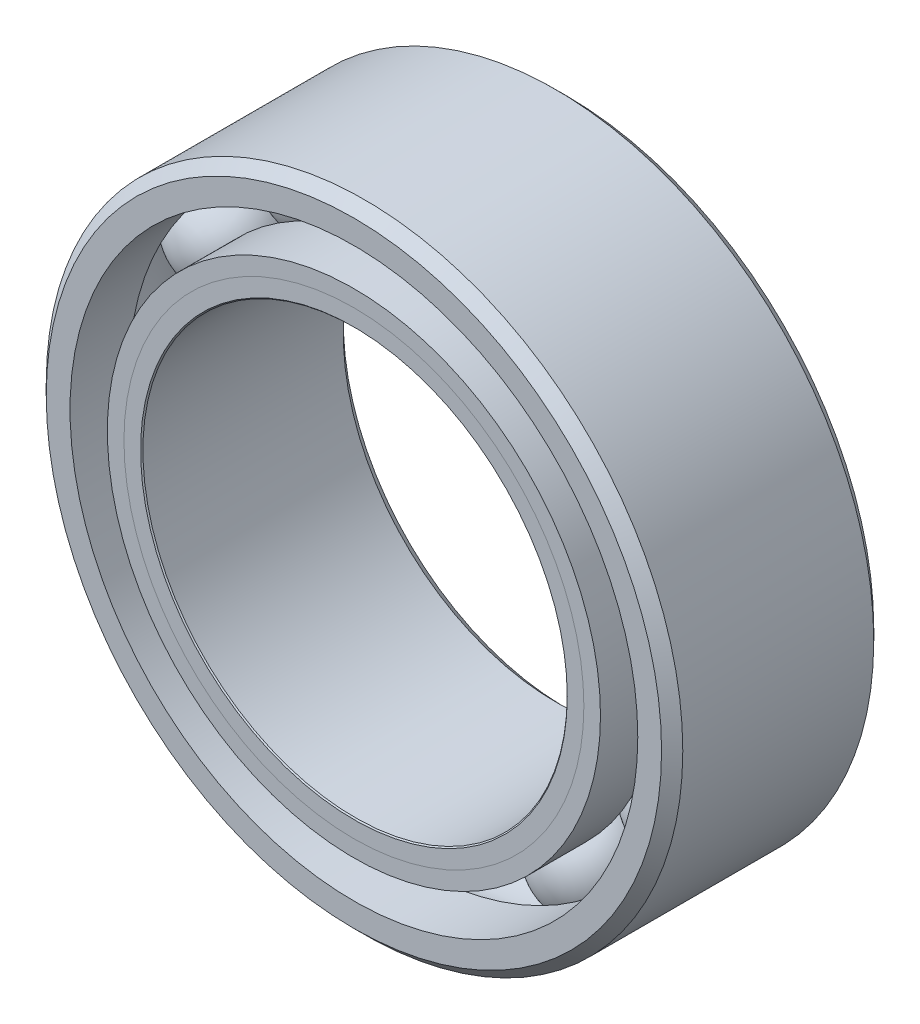
ISO-10303-21;
HEADER;
FILE_DESCRIPTION(('STEP AP214'),'2;1');
FILE_NAME('part.step','',(''),(''),'','','');
FILE_SCHEMA(('AUTOMOTIVE_DESIGN { 1 0 10303 214 1 1 1 1 }'));
ENDSEC;
DATA;
#1=APPLICATION_CONTEXT('core data for automotive mechanical design processes');
#2=APPLICATION_PROTOCOL_DEFINITION('international standard','automotive_design',2000,#1);
#3=PRODUCT_CONTEXT('',#1,'mechanical');
#4=PRODUCT('Part','Part','',(#3));
#5=PRODUCT_RELATED_PRODUCT_CATEGORY('part','',(#4));
#6=PRODUCT_DEFINITION_FORMATION('','',#4);
#7=PRODUCT_DEFINITION_CONTEXT('part definition',#1,'design');
#8=PRODUCT_DEFINITION('design','',#6,#7);
#9=PRODUCT_DEFINITION_SHAPE('','',#8);
#10=(LENGTH_UNIT() NAMED_UNIT(*) SI_UNIT(.MILLI.,.METRE.));
#11=(NAMED_UNIT(*) PLANE_ANGLE_UNIT() SI_UNIT($,.RADIAN.));
#12=(NAMED_UNIT(*) SI_UNIT($,.STERADIAN.) SOLID_ANGLE_UNIT());
#13=UNCERTAINTY_MEASURE_WITH_UNIT(LENGTH_MEASURE(1.E-05),#10,'distance_accuracy_value','');
#14=(GEOMETRIC_REPRESENTATION_CONTEXT(3) GLOBAL_UNCERTAINTY_ASSIGNED_CONTEXT((#13)) GLOBAL_UNIT_ASSIGNED_CONTEXT((#10,
#11,#12)) REPRESENTATION_CONTEXT('',''));
#15=CARTESIAN_POINT('',(0.,0.,0.));
#16=DIRECTION('',(0.,0.,1.));
#17=DIRECTION('',(1.,0.,0.));
#18=AXIS2_PLACEMENT_3D('',#15,#16,#17);
#19=CARTESIAN_POINT('',(-1.98437499999996,3.43703832126952,0.));
#20=DIRECTION('',(0.,0.,1.));
#21=DIRECTION('',(-0.499999999999989,0.866025403784445,0.));
#22=AXIS2_PLACEMENT_3D('',#19,#20,#21);
#23=SPHERICAL_SURFACE('',#22,0.758760243513404);
#24=CARTESIAN_POINT('',(-1.98437499999996,3.43703832126952,0.758760243513404));
#25=VERTEX_POINT('',#24);
#26=VERTEX_LOOP('',#25);
#27=FACE_BOUND('',#26,.T.);
#28=ADVANCED_FACE('F48',(#27),#23,.T.);
#29=CLOSED_SHELL('',(#28));
#30=MANIFOLD_SOLID_BREP('B2',#29);
#31=CARTESIAN_POINT('',(-3.43703832126947,1.98437500000004,0.));
#32=DIRECTION('',(0.,0.,1.));
#33=DIRECTION('',(-0.866025403784433,0.50000000000001,0.));
#34=AXIS2_PLACEMENT_3D('',#31,#32,#33);
#35=SPHERICAL_SURFACE('',#34,0.758760243513404);
#36=CARTESIAN_POINT('',(-3.43703832126947,1.98437500000004,0.758760243513404));
#37=VERTEX_POINT('',#36);
#38=VERTEX_LOOP('',#37);
#39=FACE_BOUND('',#38,.T.);
#40=ADVANCED_FACE('F88',(#39),#35,.T.);
#41=CLOSED_SHELL('',(#40));
#42=MANIFOLD_SOLID_BREP('B6',#41);
#43=CARTESIAN_POINT('',(-3.96875,0.,0.));
#44=DIRECTION('',(0.,0.,1.));
#45=DIRECTION('',(-1.,0.,0.));
#46=AXIS2_PLACEMENT_3D('',#43,#44,#45);
#47=SPHERICAL_SURFACE('',#46,0.758760243513404);
#48=CARTESIAN_POINT('',(-3.96875,0.,0.758760243513404));
#49=VERTEX_POINT('',#48);
#50=VERTEX_LOOP('',#49);
#51=FACE_BOUND('',#50,.T.);
#52=ADVANCED_FACE('F128',(#51),#47,.T.);
#53=CLOSED_SHELL('',(#52));
#54=MANIFOLD_SOLID_BREP('B44',#53);
#55=CARTESIAN_POINT('',(-3.43703832126951,-1.98437499999997,0.));
#56=DIRECTION('',(0.,0.,1.));
#57=DIRECTION('',(-0.866025403784443,-0.499999999999992,0.));
#58=AXIS2_PLACEMENT_3D('',#55,#56,#57);
#59=SPHERICAL_SURFACE('',#58,0.758760243513404);
#60=CARTESIAN_POINT('',(-3.43703832126951,-1.98437499999997,0.758760243513404));
#61=VERTEX_POINT('',#60);
#62=VERTEX_LOOP('',#61);
#63=FACE_BOUND('',#62,.T.);
#64=ADVANCED_FACE('F168',(#63),#59,.T.);
#65=CLOSED_SHELL('',(#64));
#66=MANIFOLD_SOLID_BREP('B84',#65);
#67=CARTESIAN_POINT('',(-1.98437500000003,-3.43703832126947,0.));
#68=DIRECTION('',(0.,0.,1.));
#69=DIRECTION('',(-0.500000000000007,-0.866025403784435,0.));
#70=AXIS2_PLACEMENT_3D('',#67,#68,#69);
#71=SPHERICAL_SURFACE('',#70,0.758760243513404);
#72=CARTESIAN_POINT('',(-1.98437500000003,-3.43703832126947,0.758760243513404));
#73=VERTEX_POINT('',#72);
#74=VERTEX_LOOP('',#73);
#75=FACE_BOUND('',#74,.T.);
#76=ADVANCED_FACE('F208',(#75),#71,.T.);
#77=CLOSED_SHELL('',(#76));
#78=MANIFOLD_SOLID_BREP('B124',#77);
#79=CARTESIAN_POINT('',(0.,-3.96875,0.));
#80=DIRECTION('',(0.,0.,1.));
#81=DIRECTION('',(0.,-1.,0.));
#82=AXIS2_PLACEMENT_3D('',#79,#80,#81);
#83=SPHERICAL_SURFACE('',#82,0.758760243513404);
#84=CARTESIAN_POINT('',(0.,-3.96875,0.758760243513404));
#85=VERTEX_POINT('',#84);
#86=VERTEX_LOOP('',#85);
#87=FACE_BOUND('',#86,.T.);
#88=ADVANCED_FACE('F248',(#87),#83,.T.);
#89=CLOSED_SHELL('',(#88));
#90=MANIFOLD_SOLID_BREP('B164',#89);
#91=CARTESIAN_POINT('',(1.98437499999998,-3.4370383212695,0.));
#92=DIRECTION('',(0.,0.,1.));
#93=DIRECTION('',(0.499999999999995,-0.866025403784442,0.));
#94=AXIS2_PLACEMENT_3D('',#91,#92,#93);
#95=SPHERICAL_SURFACE('',#94,0.758760243513404);
#96=CARTESIAN_POINT('',(1.98437499999998,-3.4370383212695,0.758760243513404));
#97=VERTEX_POINT('',#96);
#98=VERTEX_LOOP('',#97);
#99=FACE_BOUND('',#98,.T.);
#100=ADVANCED_FACE('F288',(#99),#95,.T.);
#101=CLOSED_SHELL('',(#100));
#102=MANIFOLD_SOLID_BREP('B204',#101);
#103=CARTESIAN_POINT('',(3.43703832126948,-1.98437500000002,0.));
#104=DIRECTION('',(0.,0.,1.));
#105=DIRECTION('',(0.866025403784436,-0.500000000000004,0.));
#106=AXIS2_PLACEMENT_3D('',#103,#104,#105);
#107=SPHERICAL_SURFACE('',#106,0.758760243513404);
#108=CARTESIAN_POINT('',(3.43703832126948,-1.98437500000002,0.758760243513404));
#109=VERTEX_POINT('',#108);
#110=VERTEX_LOOP('',#109);
#111=FACE_BOUND('',#110,.T.);
#112=ADVANCED_FACE('F328',(#111),#107,.T.);
#113=CLOSED_SHELL('',(#112));
#114=MANIFOLD_SOLID_BREP('B244',#113);
#115=CARTESIAN_POINT('',(3.96875,0.,0.));
#116=DIRECTION('',(0.,0.,1.));
#117=DIRECTION('',(1.,0.,0.));
#118=AXIS2_PLACEMENT_3D('',#115,#116,#117);
#119=SPHERICAL_SURFACE('',#118,0.758760243513404);
#120=CARTESIAN_POINT('',(3.96875,0.,0.758760243513404));
#121=VERTEX_POINT('',#120);
#122=VERTEX_LOOP('',#121);
#123=FACE_BOUND('',#122,.T.);
#124=ADVANCED_FACE('F368',(#123),#119,.T.);
#125=CLOSED_SHELL('',(#124));
#126=MANIFOLD_SOLID_BREP('B284',#125);
#127=CARTESIAN_POINT('',(3.4370383212695,1.98437499999999,0.));
#128=DIRECTION('',(0.,0.,1.));
#129=DIRECTION('',(0.86602540378444,0.499999999999998,0.));
#130=AXIS2_PLACEMENT_3D('',#127,#128,#129);
#131=SPHERICAL_SURFACE('',#130,0.758760243513404);
#132=CARTESIAN_POINT('',(3.4370383212695,1.98437499999999,0.758760243513404));
#133=VERTEX_POINT('',#132);
#134=VERTEX_LOOP('',#133);
#135=FACE_BOUND('',#134,.T.);
#136=ADVANCED_FACE('F408',(#135),#131,.T.);
#137=CLOSED_SHELL('',(#136));
#138=MANIFOLD_SOLID_BREP('B324',#137);
#139=CARTESIAN_POINT('',(1.984375,3.43703832126949,0.));
#140=DIRECTION('',(0.,0.,1.));
#141=DIRECTION('',(0.500000000000001,0.866025403784438,0.));
#142=AXIS2_PLACEMENT_3D('',#139,#140,#141);
#143=SPHERICAL_SURFACE('',#142,0.758760243513404);
#144=CARTESIAN_POINT('',(1.984375,3.43703832126949,0.758760243513404));
#145=VERTEX_POINT('',#144);
#146=VERTEX_LOOP('',#145);
#147=FACE_BOUND('',#146,.T.);
#148=ADVANCED_FACE('F448',(#147),#143,.T.);
#149=CLOSED_SHELL('',(#148));
#150=MANIFOLD_SOLID_BREP('B364',#149);
#151=CARTESIAN_POINT('',(0.,3.96875,0.));
#152=DIRECTION('',(0.,0.,1.));
#153=DIRECTION('',(0.,1.,0.));
#154=AXIS2_PLACEMENT_3D('',#151,#152,#153);
#155=SPHERICAL_SURFACE('',#154,0.758760243513404);
#156=CARTESIAN_POINT('',(0.,3.96875,0.758760243513404));
#157=VERTEX_POINT('',#156);
#158=VERTEX_LOOP('',#157);
#159=FACE_BOUND('',#158,.T.);
#160=ADVANCED_FACE('F490',(#159),#155,.T.);
#161=CLOSED_SHELL('',(#160));
#162=MANIFOLD_SOLID_BREP('B404',#161);
#163=CARTESIAN_POINT('',(0.,3.44106199956121,1.5875));
#164=DIRECTION('',(0.,0.,-1.));
#165=DIRECTION('',(-1.,0.,0.));
#166=AXIS2_PLACEMENT_3D('',#163,#164,#165);
#167=PLANE('',#166);
#168=CARTESIAN_POINT('',(0.,0.,1.5875));
#169=DIRECTION('',(0.,0.,1.));
#170=DIRECTION('',(1.,0.,0.));
#171=AXIS2_PLACEMENT_3D('',#168,#169,#170);
#172=CIRCLE('',#171,3.1924948782433);
#173=CARTESIAN_POINT('',(3.1924948782433,0.,1.5875));
#174=VERTEX_POINT('',#173);
#175=EDGE_CURVE('E543',#174,#174,#172,.T.);
#176=ORIENTED_EDGE('',*,*,#175,.F.);
#177=EDGE_LOOP('',(#176));
#178=FACE_BOUND('',#177,.T.);
#179=CARTESIAN_POINT('',(0.,0.,1.5875));
#180=DIRECTION('',(0.,0.,1.));
#181=DIRECTION('',(1.,0.,0.));
#182=AXIS2_PLACEMENT_3D('',#179,#180,#181);
#183=CIRCLE('',#182,3.44106199956121);
#184=CARTESIAN_POINT('',(3.44106199956121,0.,1.5875));
#185=VERTEX_POINT('',#184);
#186=EDGE_CURVE('E489',#185,#185,#183,.T.);
#187=ORIENTED_EDGE('',*,*,#186,.T.);
#188=EDGE_LOOP('',(#187));
#189=FACE_BOUND('',#188,.T.);
#190=ADVANCED_FACE('F509',(#178,#189),#167,.F.);
#191=CARTESIAN_POINT('',(0.,0.,1.33893287868209));
#192=DIRECTION('',(0.,0.,1.));
#193=DIRECTION('',(1.,0.,0.));
#194=AXIS2_PLACEMENT_3D('',#191,#192,#193);
#195=CONICAL_SURFACE('',#194,3.1924948782433,0.785398163397449);
#196=ORIENTED_EDGE('',*,*,#186,.F.);
#197=EDGE_LOOP('',(#196));
#198=FACE_BOUND('',#197,.T.);
#199=CARTESIAN_POINT('',(0.,0.,1.33893287868209));
#200=DIRECTION('',(0.,0.,1.));
#201=DIRECTION('',(1.,0.,0.));
#202=AXIS2_PLACEMENT_3D('',#199,#200,#201);
#203=CIRCLE('',#202,3.1924948782433);
#204=CARTESIAN_POINT('',(3.1924948782433,0.,1.33893287868209));
#205=VERTEX_POINT('',#204);
#206=EDGE_CURVE('E515',#205,#205,#203,.T.);
#207=ORIENTED_EDGE('',*,*,#206,.T.);
#208=EDGE_LOOP('',(#207));
#209=FACE_BOUND('',#208,.T.);
#210=ADVANCED_FACE('F550',(#198,#209),#195,.T.);
#211=CARTESIAN_POINT('',(0.,0.,1.5875));
#212=DIRECTION('',(0.,0.,1.));
#213=DIRECTION('',(1.,0.,0.));
#214=AXIS2_PLACEMENT_3D('',#211,#212,#213);
#215=CYLINDRICAL_SURFACE('',#214,3.1924948782433);
#216=ORIENTED_EDGE('',*,*,#206,.F.);
#217=EDGE_LOOP('',(#216));
#218=FACE_BOUND('',#217,.T.);
#219=CARTESIAN_POINT('',(0.,0.,0.));
#220=DIRECTION('',(0.,0.,1.));
#221=DIRECTION('',(1.,0.,0.));
#222=AXIS2_PLACEMENT_3D('',#219,#220,#221);
#223=CIRCLE('',#222,3.1924948782433);
#224=CARTESIAN_POINT('',(3.1924948782433,0.,0.));
#225=VERTEX_POINT('',#224);
#226=EDGE_CURVE('E519',#225,#225,#223,.T.);
#227=ORIENTED_EDGE('',*,*,#226,.T.);
#228=EDGE_LOOP('',(#227));
#229=FACE_BOUND('',#228,.T.);
#230=ADVANCED_FACE('F554',(#218,#229),#215,.T.);
#231=CARTESIAN_POINT('',(0.,3.1924948782433,0.));
#232=DIRECTION('',(0.,0.,-1.));
#233=DIRECTION('',(-1.,0.,0.));
#234=AXIS2_PLACEMENT_3D('',#231,#232,#233);
#235=PLANE('',#234);
#236=ORIENTED_EDGE('',*,*,#226,.F.);
#237=EDGE_LOOP('',(#236));
#238=FACE_BOUND('',#237,.T.);
#239=CARTESIAN_POINT('',(0.,0.,0.));
#240=DIRECTION('',(0.,0.,1.));
#241=DIRECTION('',(1.,0.,0.));
#242=AXIS2_PLACEMENT_3D('',#239,#240,#241);
#243=CIRCLE('',#242,3.2099897564866);
#244=CARTESIAN_POINT('',(3.2099897564866,0.,0.));
#245=VERTEX_POINT('',#244);
#246=EDGE_CURVE('E523',#245,#245,#243,.T.);
#247=ORIENTED_EDGE('',*,*,#246,.T.);
#248=EDGE_LOOP('',(#247));
#249=FACE_BOUND('',#248,.T.);
#250=ADVANCED_FACE('F559',(#238,#249),#235,.F.);
#251=CARTESIAN_POINT('',(0.,0.,0.));
#252=DIRECTION('',(0.,0.,1.));
#253=DIRECTION('',(1.,0.,0.));
#254=AXIS2_PLACEMENT_3D('',#251,#252,#253);
#255=TOROIDAL_SURFACE('',#254,3.96875,0.758760243513404);
#256=ORIENTED_EDGE('',*,*,#246,.F.);
#257=EDGE_LOOP('',(#256));
#258=FACE_BOUND('',#257,.T.);
#259=CARTESIAN_POINT('',(0.,0.,-0.705555555555556));
#260=DIRECTION('',(0.,0.,1.));
#261=DIRECTION('',(1.,0.,0.));
#262=AXIS2_PLACEMENT_3D('',#259,#260,#261);
#263=CIRCLE('',#262,3.68962912087912);
#264=CARTESIAN_POINT('',(3.68962912087912,0.,-0.705555555555556));
#265=VERTEX_POINT('',#264);
#266=EDGE_CURVE('E528',#265,#265,#263,.T.);
#267=ORIENTED_EDGE('',*,*,#266,.T.);
#268=EDGE_LOOP('',(#267));
#269=FACE_BOUND('',#268,.T.);
#270=ADVANCED_FACE('F565',(#258,#269),#255,.F.);
#271=CARTESIAN_POINT('',(0.,0.,1.5875));
#272=DIRECTION('',(0.,0.,1.));
#273=DIRECTION('',(1.,0.,0.));
#274=AXIS2_PLACEMENT_3D('',#271,#272,#273);
#275=CYLINDRICAL_SURFACE('',#274,3.68962912087912);
#276=ORIENTED_EDGE('',*,*,#266,.F.);
#277=EDGE_LOOP('',(#276));
#278=FACE_BOUND('',#277,.T.);
#279=CARTESIAN_POINT('',(0.,0.,-1.5875));
#280=DIRECTION('',(0.,0.,1.));
#281=DIRECTION('',(1.,0.,0.));
#282=AXIS2_PLACEMENT_3D('',#279,#280,#281);
#283=CIRCLE('',#282,3.68962912087912);
#284=CARTESIAN_POINT('',(3.68962912087912,0.,-1.5875));
#285=VERTEX_POINT('',#284);
#286=EDGE_CURVE('E531',#285,#285,#283,.T.);
#287=ORIENTED_EDGE('',*,*,#286,.T.);
#288=EDGE_LOOP('',(#287));
#289=FACE_BOUND('',#288,.T.);
#290=ADVANCED_FACE('F569',(#278,#289),#275,.T.);
#291=CARTESIAN_POINT('',(0.,3.33375,-1.5875));
#292=DIRECTION('',(0.,0.,1.));
#293=DIRECTION('',(1.,0.,0.));
#294=AXIS2_PLACEMENT_3D('',#291,#292,#293);
#295=PLANE('',#294);
#296=ORIENTED_EDGE('',*,*,#286,.F.);
#297=EDGE_LOOP('',(#296));
#298=FACE_BOUND('',#297,.T.);
#299=CARTESIAN_POINT('',(0.,0.,-1.5875));
#300=DIRECTION('',(0.,0.,1.));
#301=DIRECTION('',(1.,0.,0.));
#302=AXIS2_PLACEMENT_3D('',#299,#300,#301);
#303=CIRCLE('',#302,3.33375);
#304=CARTESIAN_POINT('',(3.33375,0.,-1.5875));
#305=VERTEX_POINT('',#304);
#306=EDGE_CURVE('E534',#305,#305,#303,.T.);
#307=ORIENTED_EDGE('',*,*,#306,.T.);
#308=EDGE_LOOP('',(#307));
#309=FACE_BOUND('',#308,.T.);
#310=ADVANCED_FACE('F573',(#298,#309),#295,.F.);
#311=CARTESIAN_POINT('',(0.,0.,-1.42875));
#312=DIRECTION('',(0.,0.,-1.));
#313=DIRECTION('',(-1.,0.,0.));
#314=AXIS2_PLACEMENT_3D('',#311,#312,#313);
#315=CONICAL_SURFACE('',#314,3.175,0.78539816339745);
#316=ORIENTED_EDGE('',*,*,#306,.F.);
#317=EDGE_LOOP('',(#316));
#318=FACE_BOUND('',#317,.T.);
#319=CARTESIAN_POINT('',(0.,0.,-1.42875));
#320=DIRECTION('',(0.,0.,1.));
#321=DIRECTION('',(1.,0.,0.));
#322=AXIS2_PLACEMENT_3D('',#319,#320,#321);
#323=CIRCLE('',#322,3.175);
#324=CARTESIAN_POINT('',(3.175,0.,-1.42875));
#325=VERTEX_POINT('',#324);
#326=EDGE_CURVE('E537',#325,#325,#323,.T.);
#327=ORIENTED_EDGE('',*,*,#326,.T.);
#328=EDGE_LOOP('',(#327));
#329=FACE_BOUND('',#328,.T.);
#330=ADVANCED_FACE('F577',(#318,#329),#315,.F.);
#331=CARTESIAN_POINT('',(0.,0.,1.5875));
#332=DIRECTION('',(0.,0.,1.));
#333=DIRECTION('',(1.,0.,0.));
#334=AXIS2_PLACEMENT_3D('',#331,#332,#333);
#335=CYLINDRICAL_SURFACE('',#334,3.175);
#336=ORIENTED_EDGE('',*,*,#326,.F.);
#337=EDGE_LOOP('',(#336));
#338=FACE_BOUND('',#337,.T.);
#339=CARTESIAN_POINT('',(0.,0.,1.5700051217567));
#340=DIRECTION('',(0.,0.,1.));
#341=DIRECTION('',(1.,0.,0.));
#342=AXIS2_PLACEMENT_3D('',#339,#340,#341);
#343=CIRCLE('',#342,3.175);
#344=CARTESIAN_POINT('',(3.175,0.,1.5700051217567));
#345=VERTEX_POINT('',#344);
#346=EDGE_CURVE('E540',#345,#345,#343,.T.);
#347=ORIENTED_EDGE('',*,*,#346,.T.);
#348=EDGE_LOOP('',(#347));
#349=FACE_BOUND('',#348,.T.);
#350=ADVANCED_FACE('F581',(#338,#349),#335,.F.);
#351=CARTESIAN_POINT('',(0.,0.,1.5875));
#352=DIRECTION('',(0.,0.,1.));
#353=DIRECTION('',(1.,0.,0.));
#354=AXIS2_PLACEMENT_3D('',#351,#352,#353);
#355=CONICAL_SURFACE('',#354,3.1924948782433,0.785398163397461);
#356=ORIENTED_EDGE('',*,*,#346,.F.);
#357=EDGE_LOOP('',(#356));
#358=FACE_BOUND('',#357,.T.);
#359=ORIENTED_EDGE('',*,*,#175,.T.);
#360=EDGE_LOOP('',(#359));
#361=FACE_BOUND('',#360,.T.);
#362=ADVANCED_FACE('F547',(#358,#361),#355,.F.);
#363=CLOSED_SHELL('',(#190,#210,#230,#250,#270,#290,#310,#330,#350,#362));
#364=MANIFOLD_SOLID_BREP('B444',#363);
#365=CARTESIAN_POINT('',(0.,3.68962912087912,1.5875));
#366=DIRECTION('',(0.,0.,-1.));
#367=DIRECTION('',(-1.,0.,0.));
#368=AXIS2_PLACEMENT_3D('',#365,#366,#367);
#369=PLANE('',#368);
#370=CARTESIAN_POINT('',(0.,0.,1.5875));
#371=DIRECTION('',(0.,0.,1.));
#372=DIRECTION('',(1.,0.,0.));
#373=AXIS2_PLACEMENT_3D('',#370,#371,#372);
#374=CIRCLE('',#373,3.44106199956121);
#375=CARTESIAN_POINT('',(3.44106199956121,0.,1.5875));
#376=VERTEX_POINT('',#375);
#377=EDGE_CURVE('E508',#376,#376,#374,.T.);
#378=ORIENTED_EDGE('',*,*,#377,.F.);
#379=EDGE_LOOP('',(#378));
#380=FACE_BOUND('',#379,.T.);
#381=CARTESIAN_POINT('',(0.,0.,1.5875));
#382=DIRECTION('',(0.,0.,1.));
#383=DIRECTION('',(1.,0.,0.));
#384=AXIS2_PLACEMENT_3D('',#381,#382,#383);
#385=CIRCLE('',#384,3.68962912087912);
#386=CARTESIAN_POINT('',(3.68962912087912,0.,1.5875));
#387=VERTEX_POINT('',#386);
#388=EDGE_CURVE('E670',#387,#387,#385,.T.);
#389=ORIENTED_EDGE('',*,*,#388,.T.);
#390=EDGE_LOOP('',(#389));
#391=FACE_BOUND('',#390,.T.);
#392=ADVANCED_FACE('F648',(#380,#391),#369,.F.);
#393=CARTESIAN_POINT('',(0.,0.,1.5875));
#394=DIRECTION('',(0.,0.,1.));
#395=DIRECTION('',(1.,0.,0.));
#396=AXIS2_PLACEMENT_3D('',#393,#394,#395);
#397=CONICAL_SURFACE('',#396,3.44106199956121,0.785398163397449);
#398=CARTESIAN_POINT('',(0.,0.,1.33893287868209));
#399=DIRECTION('',(0.,0.,1.));
#400=DIRECTION('',(1.,0.,0.));
#401=AXIS2_PLACEMENT_3D('',#398,#399,#400);
#402=CIRCLE('',#401,3.1924948782433);
#403=CARTESIAN_POINT('',(3.1924948782433,0.,1.33893287868209));
#404=VERTEX_POINT('',#403);
#405=EDGE_CURVE('E654',#404,#404,#402,.T.);
#406=ORIENTED_EDGE('',*,*,#405,.F.);
#407=EDGE_LOOP('',(#406));
#408=FACE_BOUND('',#407,.T.);
#409=ORIENTED_EDGE('',*,*,#377,.T.);
#410=EDGE_LOOP('',(#409));
#411=FACE_BOUND('',#410,.T.);
#412=ADVANCED_FACE('F695',(#408,#411),#397,.F.);
#413=CARTESIAN_POINT('',(0.,0.,1.5875));
#414=DIRECTION('',(0.,0.,1.));
#415=DIRECTION('',(1.,0.,0.));
#416=AXIS2_PLACEMENT_3D('',#413,#414,#415);
#417=CYLINDRICAL_SURFACE('',#416,3.1924948782433);
#418=CARTESIAN_POINT('',(0.,0.,0.));
#419=DIRECTION('',(0.,0.,1.));
#420=DIRECTION('',(1.,0.,0.));
#421=AXIS2_PLACEMENT_3D('',#418,#419,#420);
#422=CIRCLE('',#421,3.1924948782433);
#423=CARTESIAN_POINT('',(3.1924948782433,0.,0.));
#424=VERTEX_POINT('',#423);
#425=EDGE_CURVE('E658',#424,#424,#422,.T.);
#426=ORIENTED_EDGE('',*,*,#425,.F.);
#427=EDGE_LOOP('',(#426));
#428=FACE_BOUND('',#427,.T.);
#429=ORIENTED_EDGE('',*,*,#405,.T.);
#430=EDGE_LOOP('',(#429));
#431=FACE_BOUND('',#430,.T.);
#432=ADVANCED_FACE('F690',(#428,#431),#417,.F.);
#433=CARTESIAN_POINT('',(0.,3.1924948782433,0.));
#434=DIRECTION('',(0.,0.,1.));
#435=DIRECTION('',(1.,0.,0.));
#436=AXIS2_PLACEMENT_3D('',#433,#434,#435);
#437=PLANE('',#436);
#438=CARTESIAN_POINT('',(0.,0.,0.));
#439=DIRECTION('',(0.,0.,1.));
#440=DIRECTION('',(1.,0.,0.));
#441=AXIS2_PLACEMENT_3D('',#438,#439,#440);
#442=CIRCLE('',#441,3.2099897564866);
#443=CARTESIAN_POINT('',(3.2099897564866,0.,0.));
#444=VERTEX_POINT('',#443);
#445=EDGE_CURVE('E662',#444,#444,#442,.T.);
#446=ORIENTED_EDGE('',*,*,#445,.F.);
#447=EDGE_LOOP('',(#446));
#448=FACE_BOUND('',#447,.T.);
#449=ORIENTED_EDGE('',*,*,#425,.T.);
#450=EDGE_LOOP('',(#449));
#451=FACE_BOUND('',#450,.T.);
#452=ADVANCED_FACE('F684',(#448,#451),#437,.F.);
#453=CARTESIAN_POINT('',(0.,0.,0.));
#454=DIRECTION('',(0.,0.,1.));
#455=DIRECTION('',(1.,0.,0.));
#456=AXIS2_PLACEMENT_3D('',#453,#454,#455);
#457=TOROIDAL_SURFACE('',#456,3.96875,0.758760243513404);
#458=CARTESIAN_POINT('',(0.,0.,0.705555555555555));
#459=DIRECTION('',(0.,0.,1.));
#460=DIRECTION('',(1.,0.,0.));
#461=AXIS2_PLACEMENT_3D('',#458,#459,#460);
#462=CIRCLE('',#461,3.68962912087912);
#463=CARTESIAN_POINT('',(3.68962912087912,0.,0.705555555555555));
#464=VERTEX_POINT('',#463);
#465=EDGE_CURVE('E667',#464,#464,#462,.T.);
#466=ORIENTED_EDGE('',*,*,#465,.F.);
#467=EDGE_LOOP('',(#466));
#468=FACE_BOUND('',#467,.T.);
#469=ORIENTED_EDGE('',*,*,#445,.T.);
#470=EDGE_LOOP('',(#469));
#471=FACE_BOUND('',#470,.T.);
#472=ADVANCED_FACE('F678',(#468,#471),#457,.F.);
#473=CARTESIAN_POINT('',(0.,0.,1.5875));
#474=DIRECTION('',(0.,0.,1.));
#475=DIRECTION('',(1.,0.,0.));
#476=AXIS2_PLACEMENT_3D('',#473,#474,#475);
#477=CYLINDRICAL_SURFACE('',#476,3.68962912087912);
#478=ORIENTED_EDGE('',*,*,#388,.F.);
#479=EDGE_LOOP('',(#478));
#480=FACE_BOUND('',#479,.T.);
#481=ORIENTED_EDGE('',*,*,#465,.T.);
#482=EDGE_LOOP('',(#481));
#483=FACE_BOUND('',#482,.T.);
#484=ADVANCED_FACE('F675',(#480,#483),#477,.T.);
#485=CLOSED_SHELL('',(#392,#412,#432,#452,#472,#484));
#486=MANIFOLD_SOLID_BREP('B484',#485);
#487=CARTESIAN_POINT('',(0.,0.,1.42875));
#488=DIRECTION('',(0.,0.,-1.));
#489=DIRECTION('',(-1.,0.,0.));
#490=AXIS2_PLACEMENT_3D('',#487,#488,#489);
#491=CONICAL_SURFACE('',#490,4.7625,0.785398163397448);
#492=CARTESIAN_POINT('',(0.,0.,1.5875));
#493=DIRECTION('',(0.,0.,1.));
#494=DIRECTION('',(1.,0.,0.));
#495=AXIS2_PLACEMENT_3D('',#492,#493,#494);
#496=CIRCLE('',#495,4.60375);
#497=CARTESIAN_POINT('',(4.60375,0.,1.5875));
#498=VERTEX_POINT('',#497);
#499=EDGE_CURVE('E756',#498,#498,#496,.T.);
#500=ORIENTED_EDGE('',*,*,#499,.F.);
#501=EDGE_LOOP('',(#500));
#502=FACE_BOUND('',#501,.T.);
#503=CARTESIAN_POINT('',(0.,0.,1.42875));
#504=DIRECTION('',(0.,0.,1.));
#505=DIRECTION('',(1.,0.,0.));
#506=AXIS2_PLACEMENT_3D('',#503,#504,#505);
#507=CIRCLE('',#506,4.7625);
#508=CARTESIAN_POINT('',(4.7625,0.,1.42875));
#509=VERTEX_POINT('',#508);
#510=EDGE_CURVE('E647',#509,#509,#507,.T.);
#511=ORIENTED_EDGE('',*,*,#510,.T.);
#512=EDGE_LOOP('',(#511));
#513=FACE_BOUND('',#512,.T.);
#514=ADVANCED_FACE('F728',(#502,#513),#491,.T.);
#515=CARTESIAN_POINT('',(0.,0.,1.5875));
#516=DIRECTION('',(0.,0.,1.));
#517=DIRECTION('',(1.,0.,0.));
#518=AXIS2_PLACEMENT_3D('',#515,#516,#517);
#519=CYLINDRICAL_SURFACE('',#518,4.7625);
#520=ORIENTED_EDGE('',*,*,#510,.F.);
#521=EDGE_LOOP('',(#520));
#522=FACE_BOUND('',#521,.T.);
#523=CARTESIAN_POINT('',(0.,0.,-1.42875));
#524=DIRECTION('',(0.,0.,1.));
#525=DIRECTION('',(1.,0.,0.));
#526=AXIS2_PLACEMENT_3D('',#523,#524,#525);
#527=CIRCLE('',#526,4.7625);
#528=CARTESIAN_POINT('',(4.7625,0.,-1.42875));
#529=VERTEX_POINT('',#528);
#530=EDGE_CURVE('E734',#529,#529,#527,.T.);
#531=ORIENTED_EDGE('',*,*,#530,.T.);
#532=EDGE_LOOP('',(#531));
#533=FACE_BOUND('',#532,.T.);
#534=ADVANCED_FACE('F763',(#522,#533),#519,.T.);
#535=CARTESIAN_POINT('',(0.,0.,-1.5875));
#536=DIRECTION('',(0.,0.,1.));
#537=DIRECTION('',(1.,0.,0.));
#538=AXIS2_PLACEMENT_3D('',#535,#536,#537);
#539=CONICAL_SURFACE('',#538,4.60375,0.785398163397447);
#540=ORIENTED_EDGE('',*,*,#530,.F.);
#541=EDGE_LOOP('',(#540));
#542=FACE_BOUND('',#541,.T.);
#543=CARTESIAN_POINT('',(0.,0.,-1.5875));
#544=DIRECTION('',(0.,0.,1.));
#545=DIRECTION('',(1.,0.,0.));
#546=AXIS2_PLACEMENT_3D('',#543,#544,#545);
#547=CIRCLE('',#546,4.60375);
#548=CARTESIAN_POINT('',(4.60375,0.,-1.5875));
#549=VERTEX_POINT('',#548);
#550=EDGE_CURVE('E738',#549,#549,#547,.T.);
#551=ORIENTED_EDGE('',*,*,#550,.T.);
#552=EDGE_LOOP('',(#551));
#553=FACE_BOUND('',#552,.T.);
#554=ADVANCED_FACE('F767',(#542,#553),#539,.T.);
#555=CARTESIAN_POINT('',(0.,4.60375,-1.5875));
#556=DIRECTION('',(0.,0.,1.));
#557=DIRECTION('',(1.,0.,0.));
#558=AXIS2_PLACEMENT_3D('',#555,#556,#557);
#559=PLANE('',#558);
#560=ORIENTED_EDGE('',*,*,#550,.F.);
#561=EDGE_LOOP('',(#560));
#562=FACE_BOUND('',#561,.T.);
#563=CARTESIAN_POINT('',(0.,0.,-1.5875));
#564=DIRECTION('',(0.,0.,1.));
#565=DIRECTION('',(1.,0.,0.));
#566=AXIS2_PLACEMENT_3D('',#563,#564,#565);
#567=CIRCLE('',#566,4.24787087912088);
#568=CARTESIAN_POINT('',(4.24787087912088,0.,-1.5875));
#569=VERTEX_POINT('',#568);
#570=EDGE_CURVE('E742',#569,#569,#567,.T.);
#571=ORIENTED_EDGE('',*,*,#570,.T.);
#572=EDGE_LOOP('',(#571));
#573=FACE_BOUND('',#572,.T.);
#574=ADVANCED_FACE('F772',(#562,#573),#559,.F.);
#575=CARTESIAN_POINT('',(0.,0.,1.5875));
#576=DIRECTION('',(0.,0.,1.));
#577=DIRECTION('',(1.,0.,0.));
#578=AXIS2_PLACEMENT_3D('',#575,#576,#577);
#579=CYLINDRICAL_SURFACE('',#578,4.24787087912088);
#580=ORIENTED_EDGE('',*,*,#570,.F.);
#581=EDGE_LOOP('',(#580));
#582=FACE_BOUND('',#581,.T.);
#583=CARTESIAN_POINT('',(0.,0.,-0.705555555555556));
#584=DIRECTION('',(0.,0.,1.));
#585=DIRECTION('',(1.,0.,0.));
#586=AXIS2_PLACEMENT_3D('',#583,#584,#585);
#587=CIRCLE('',#586,4.24787087912088);
#588=CARTESIAN_POINT('',(4.24787087912088,0.,-0.705555555555556));
#589=VERTEX_POINT('',#588);
#590=EDGE_CURVE('E747',#589,#589,#587,.T.);
#591=ORIENTED_EDGE('',*,*,#590,.T.);
#592=EDGE_LOOP('',(#591));
#593=FACE_BOUND('',#592,.T.);
#594=ADVANCED_FACE('F778',(#582,#593),#579,.F.);
#595=CARTESIAN_POINT('',(0.,0.,0.));
#596=DIRECTION('',(0.,0.,1.));
#597=DIRECTION('',(1.,0.,0.));
#598=AXIS2_PLACEMENT_3D('',#595,#596,#597);
#599=TOROIDAL_SURFACE('',#598,3.96875,0.758760243513404);
#600=ORIENTED_EDGE('',*,*,#590,.F.);
#601=EDGE_LOOP('',(#600));
#602=FACE_BOUND('',#601,.T.);
#603=CARTESIAN_POINT('',(0.,0.,0.705555555555555));
#604=DIRECTION('',(0.,0.,1.));
#605=DIRECTION('',(1.,0.,0.));
#606=AXIS2_PLACEMENT_3D('',#603,#604,#605);
#607=CIRCLE('',#606,4.24787087912088);
#608=CARTESIAN_POINT('',(4.24787087912088,0.,0.705555555555555));
#609=VERTEX_POINT('',#608);
#610=EDGE_CURVE('E750',#609,#609,#607,.T.);
#611=ORIENTED_EDGE('',*,*,#610,.T.);
#612=EDGE_LOOP('',(#611));
#613=FACE_BOUND('',#612,.T.);
#614=ADVANCED_FACE('F782',(#602,#613),#599,.F.);
#615=CARTESIAN_POINT('',(0.,0.,1.5875));
#616=DIRECTION('',(0.,0.,1.));
#617=DIRECTION('',(1.,0.,0.));
#618=AXIS2_PLACEMENT_3D('',#615,#616,#617);
#619=CYLINDRICAL_SURFACE('',#618,4.24787087912088);
#620=ORIENTED_EDGE('',*,*,#610,.F.);
#621=EDGE_LOOP('',(#620));
#622=FACE_BOUND('',#621,.T.);
#623=CARTESIAN_POINT('',(0.,0.,1.5875));
#624=DIRECTION('',(0.,0.,1.));
#625=DIRECTION('',(1.,0.,0.));
#626=AXIS2_PLACEMENT_3D('',#623,#624,#625);
#627=CIRCLE('',#626,4.24787087912088);
#628=CARTESIAN_POINT('',(4.24787087912088,0.,1.5875));
#629=VERTEX_POINT('',#628);
#630=EDGE_CURVE('E753',#629,#629,#627,.T.);
#631=ORIENTED_EDGE('',*,*,#630,.T.);
#632=EDGE_LOOP('',(#631));
#633=FACE_BOUND('',#632,.T.);
#634=ADVANCED_FACE('F786',(#622,#633),#619,.F.);
#635=CARTESIAN_POINT('',(0.,4.60375,1.5875));
#636=DIRECTION('',(0.,0.,-1.));
#637=DIRECTION('',(-1.,0.,0.));
#638=AXIS2_PLACEMENT_3D('',#635,#636,#637);
#639=PLANE('',#638);
#640=ORIENTED_EDGE('',*,*,#630,.F.);
#641=EDGE_LOOP('',(#640));
#642=FACE_BOUND('',#641,.T.);
#643=ORIENTED_EDGE('',*,*,#499,.T.);
#644=EDGE_LOOP('',(#643));
#645=FACE_BOUND('',#644,.T.);
#646=ADVANCED_FACE('F760',(#642,#645),#639,.F.);
#647=CLOSED_SHELL('',(#514,#534,#554,#574,#594,#614,#634,#646));
#648=MANIFOLD_SOLID_BREP('B503',#647);
#649=ADVANCED_BREP_SHAPE_REPRESENTATION('',(#18,#30,#42,#54,#66,#78,#90,#102,#114,#126,#138,
#150,#162,#364,#486,#648),#14);
#650=SHAPE_DEFINITION_REPRESENTATION(#9,#649);
ENDSEC;
END-ISO-10303-21;
